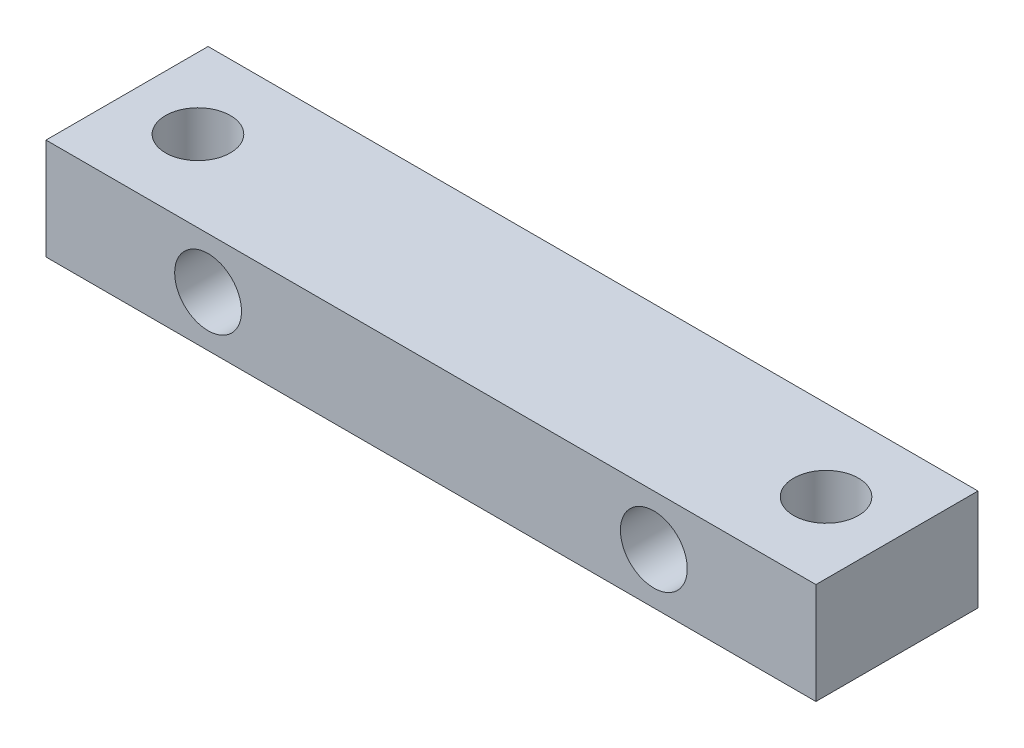
ISO-10303-21;
HEADER;
FILE_DESCRIPTION(('STEP AP214'),'2;1');
FILE_NAME('part.step','',(''),(''),'','','');
FILE_SCHEMA(('AUTOMOTIVE_DESIGN { 1 0 10303 214 1 1 1 1 }'));
ENDSEC;
DATA;
#1=APPLICATION_CONTEXT('core data for automotive mechanical design processes');
#2=APPLICATION_PROTOCOL_DEFINITION('international standard','automotive_design',2000,#1);
#3=PRODUCT_CONTEXT('',#1,'mechanical');
#4=PRODUCT('Part','Part','',(#3));
#5=PRODUCT_RELATED_PRODUCT_CATEGORY('part','',(#4));
#6=PRODUCT_DEFINITION_FORMATION('','',#4);
#7=PRODUCT_DEFINITION_CONTEXT('part definition',#1,'design');
#8=PRODUCT_DEFINITION('design','',#6,#7);
#9=PRODUCT_DEFINITION_SHAPE('','',#8);
#10=(LENGTH_UNIT() NAMED_UNIT(*) SI_UNIT(.MILLI.,.METRE.));
#11=(NAMED_UNIT(*) PLANE_ANGLE_UNIT() SI_UNIT($,.RADIAN.));
#12=(NAMED_UNIT(*) SI_UNIT($,.STERADIAN.) SOLID_ANGLE_UNIT());
#13=UNCERTAINTY_MEASURE_WITH_UNIT(LENGTH_MEASURE(1.E-05),#10,'distance_accuracy_value','');
#14=(GEOMETRIC_REPRESENTATION_CONTEXT(3) GLOBAL_UNCERTAINTY_ASSIGNED_CONTEXT((#13)) GLOBAL_UNIT_ASSIGNED_CONTEXT((#10,
#11,#12)) REPRESENTATION_CONTEXT('',''));
#15=CARTESIAN_POINT('',(0.,0.,0.));
#16=DIRECTION('',(0.,0.,1.));
#17=DIRECTION('',(1.,0.,0.));
#18=AXIS2_PLACEMENT_3D('',#15,#16,#17);
#19=CARTESIAN_POINT('',(0.,0.,8.));
#20=DIRECTION('',(1.,0.,0.));
#21=DIRECTION('',(0.,0.,-1.));
#22=AXIS2_PLACEMENT_3D('',#19,#20,#21);
#23=PLANE('',#22);
#24=DIRECTION('',(0.,-1.,0.));
#25=VECTOR('',#24,1.);
#26=CARTESIAN_POINT('',(0.,0.,0.));
#27=LINE('',#26,#25);
#28=CARTESIAN_POINT('',(0.,5.,0.));
#29=VERTEX_POINT('',#28);
#30=CARTESIAN_POINT('',(0.,0.,0.));
#31=VERTEX_POINT('',#30);
#32=EDGE_CURVE('E100',#29,#31,#27,.T.);
#33=ORIENTED_EDGE('',*,*,#32,.T.);
#34=DIRECTION('',(0.,0.,-1.));
#35=VECTOR('',#34,1.);
#36=CARTESIAN_POINT('',(0.,0.,8.));
#37=LINE('',#36,#35);
#38=CARTESIAN_POINT('',(0.,0.,8.));
#39=VERTEX_POINT('',#38);
#40=EDGE_CURVE('E11',#39,#31,#37,.T.);
#41=ORIENTED_EDGE('',*,*,#40,.F.);
#42=DIRECTION('',(0.,-1.,0.));
#43=VECTOR('',#42,1.);
#44=CARTESIAN_POINT('',(0.,0.,8.));
#45=LINE('',#44,#43);
#46=CARTESIAN_POINT('',(0.,5.,8.));
#47=VERTEX_POINT('',#46);
#48=EDGE_CURVE('E88',#47,#39,#45,.T.);
#49=ORIENTED_EDGE('',*,*,#48,.F.);
#50=DIRECTION('',(0.,0.,-1.));
#51=VECTOR('',#50,1.);
#52=CARTESIAN_POINT('',(0.,5.,8.));
#53=LINE('',#52,#51);
#54=EDGE_CURVE('E96',#47,#29,#53,.T.);
#55=ORIENTED_EDGE('',*,*,#54,.T.);
#56=EDGE_LOOP('',(#33,#41,#49,#55));
#57=FACE_BOUND('',#56,.T.);
#58=ADVANCED_FACE('F37',(#57),#23,.F.);
#59=CARTESIAN_POINT('',(0.,0.,8.));
#60=DIRECTION('',(0.,1.,0.));
#61=DIRECTION('',(0.,0.,1.));
#62=AXIS2_PLACEMENT_3D('',#59,#60,#61);
#63=PLANE('',#62);
#64=CARTESIAN_POINT('',(3.5,0.,4.));
#65=DIRECTION('',(0.,1.,0.));
#66=DIRECTION('',(0.,0.,1.));
#67=AXIS2_PLACEMENT_3D('',#64,#65,#66);
#68=CIRCLE('',#67,1.59999999999999);
#69=CARTESIAN_POINT('',(3.5,0.,5.59999999999999));
#70=VERTEX_POINT('',#69);
#71=EDGE_CURVE('E119',#70,#70,#68,.T.);
#72=ORIENTED_EDGE('',*,*,#71,.T.);
#73=EDGE_LOOP('',(#72));
#74=FACE_BOUND('',#73,.T.);
#75=CARTESIAN_POINT('',(34.5,0.,4.));
#76=DIRECTION('',(0.,1.,0.));
#77=DIRECTION('',(0.,0.,1.));
#78=AXIS2_PLACEMENT_3D('',#75,#76,#77);
#79=CIRCLE('',#78,1.59999999999999);
#80=CARTESIAN_POINT('',(34.5,0.,5.59999999999999));
#81=VERTEX_POINT('',#80);
#82=EDGE_CURVE('E103',#81,#81,#79,.T.);
#83=ORIENTED_EDGE('',*,*,#82,.T.);
#84=EDGE_LOOP('',(#83));
#85=FACE_BOUND('',#84,.T.);
#86=DIRECTION('',(1.,0.,0.));
#87=VECTOR('',#86,1.);
#88=CARTESIAN_POINT('',(0.,0.,0.));
#89=LINE('',#88,#87);
#90=CARTESIAN_POINT('',(38.,0.,0.));
#91=VERTEX_POINT('',#90);
#92=EDGE_CURVE('E92',#31,#91,#89,.T.);
#93=ORIENTED_EDGE('',*,*,#92,.T.);
#94=DIRECTION('',(0.,0.,-1.));
#95=VECTOR('',#94,1.);
#96=CARTESIAN_POINT('',(38.,0.,8.));
#97=LINE('',#96,#95);
#98=CARTESIAN_POINT('',(38.,0.,8.));
#99=VERTEX_POINT('',#98);
#100=EDGE_CURVE('E45',#99,#91,#97,.T.);
#101=ORIENTED_EDGE('',*,*,#100,.F.);
#102=DIRECTION('',(1.,0.,0.));
#103=VECTOR('',#102,1.);
#104=CARTESIAN_POINT('',(0.,0.,8.));
#105=LINE('',#104,#103);
#106=EDGE_CURVE('E83',#39,#99,#105,.T.);
#107=ORIENTED_EDGE('',*,*,#106,.F.);
#108=ORIENTED_EDGE('',*,*,#40,.T.);
#109=EDGE_LOOP('',(#93,#101,#107,#108));
#110=FACE_BOUND('',#109,.T.);
#111=ADVANCED_FACE('F91',(#74,#85,#110),#63,.F.);
#112=CARTESIAN_POINT('',(38.,0.,8.));
#113=DIRECTION('',(-1.,0.,0.));
#114=DIRECTION('',(0.,0.,1.));
#115=AXIS2_PLACEMENT_3D('',#112,#113,#114);
#116=PLANE('',#115);
#117=DIRECTION('',(0.,1.,0.));
#118=VECTOR('',#117,1.);
#119=CARTESIAN_POINT('',(38.,0.,0.));
#120=LINE('',#119,#118);
#121=CARTESIAN_POINT('',(38.,5.,0.));
#122=VERTEX_POINT('',#121);
#123=EDGE_CURVE('E70',#91,#122,#120,.T.);
#124=ORIENTED_EDGE('',*,*,#123,.T.);
#125=DIRECTION('',(0.,0.,-1.));
#126=VECTOR('',#125,1.);
#127=CARTESIAN_POINT('',(38.,5.,8.));
#128=LINE('',#127,#126);
#129=CARTESIAN_POINT('',(38.,5.,8.));
#130=VERTEX_POINT('',#129);
#131=EDGE_CURVE('E93',#130,#122,#128,.T.);
#132=ORIENTED_EDGE('',*,*,#131,.F.);
#133=DIRECTION('',(0.,1.,0.));
#134=VECTOR('',#133,1.);
#135=CARTESIAN_POINT('',(38.,0.,8.));
#136=LINE('',#135,#134);
#137=EDGE_CURVE('E86',#99,#130,#136,.T.);
#138=ORIENTED_EDGE('',*,*,#137,.F.);
#139=ORIENTED_EDGE('',*,*,#100,.T.);
#140=EDGE_LOOP('',(#124,#132,#138,#139));
#141=FACE_BOUND('',#140,.T.);
#142=ADVANCED_FACE('F94',(#141),#116,.F.);
#143=CARTESIAN_POINT('',(0.,5.,8.));
#144=DIRECTION('',(0.,-1.,0.));
#145=DIRECTION('',(0.,0.,-1.));
#146=AXIS2_PLACEMENT_3D('',#143,#144,#145);
#147=PLANE('',#146);
#148=CARTESIAN_POINT('',(3.5,5.,4.));
#149=DIRECTION('',(0.,1.,0.));
#150=DIRECTION('',(0.,0.,1.));
#151=AXIS2_PLACEMENT_3D('',#148,#149,#150);
#152=CIRCLE('',#151,1.59999999999999);
#153=CARTESIAN_POINT('',(3.5,5.,5.59999999999999));
#154=VERTEX_POINT('',#153);
#155=EDGE_CURVE('E122',#154,#154,#152,.T.);
#156=ORIENTED_EDGE('',*,*,#155,.F.);
#157=EDGE_LOOP('',(#156));
#158=FACE_BOUND('',#157,.T.);
#159=CARTESIAN_POINT('',(34.5,5.,4.));
#160=DIRECTION('',(0.,1.,0.));
#161=DIRECTION('',(0.,0.,1.));
#162=AXIS2_PLACEMENT_3D('',#159,#160,#161);
#163=CIRCLE('',#162,1.59999999999999);
#164=CARTESIAN_POINT('',(34.5,5.,5.59999999999999));
#165=VERTEX_POINT('',#164);
#166=EDGE_CURVE('E116',#165,#165,#163,.T.);
#167=ORIENTED_EDGE('',*,*,#166,.F.);
#168=EDGE_LOOP('',(#167));
#169=FACE_BOUND('',#168,.T.);
#170=DIRECTION('',(-1.,0.,0.));
#171=VECTOR('',#170,1.);
#172=CARTESIAN_POINT('',(0.,5.,0.));
#173=LINE('',#172,#171);
#174=EDGE_CURVE('E76',#122,#29,#173,.T.);
#175=ORIENTED_EDGE('',*,*,#174,.T.);
#176=ORIENTED_EDGE('',*,*,#54,.F.);
#177=DIRECTION('',(-1.,0.,0.));
#178=VECTOR('',#177,1.);
#179=CARTESIAN_POINT('',(0.,5.,8.));
#180=LINE('',#179,#178);
#181=EDGE_CURVE('E53',#130,#47,#180,.T.);
#182=ORIENTED_EDGE('',*,*,#181,.F.);
#183=ORIENTED_EDGE('',*,*,#131,.T.);
#184=EDGE_LOOP('',(#175,#176,#182,#183));
#185=FACE_BOUND('',#184,.T.);
#186=ADVANCED_FACE('F108',(#158,#169,#185),#147,.F.);
#187=CARTESIAN_POINT('',(0.,0.,8.));
#188=DIRECTION('',(0.,0.,-1.));
#189=DIRECTION('',(-1.,0.,0.));
#190=AXIS2_PLACEMENT_3D('',#187,#188,#189);
#191=PLANE('',#190);
#192=CARTESIAN_POINT('',(8.,2.5,8.));
#193=DIRECTION('',(0.,0.,-1.));
#194=DIRECTION('',(-1.,0.,0.));
#195=AXIS2_PLACEMENT_3D('',#192,#193,#194);
#196=CIRCLE('',#195,1.64999999999999);
#197=CARTESIAN_POINT('',(6.35,2.5,8.));
#198=VERTEX_POINT('',#197);
#199=EDGE_CURVE('E131',#198,#198,#196,.T.);
#200=ORIENTED_EDGE('',*,*,#199,.T.);
#201=EDGE_LOOP('',(#200));
#202=FACE_BOUND('',#201,.T.);
#203=CARTESIAN_POINT('',(30.,2.5,8.));
#204=DIRECTION('',(0.,0.,-1.));
#205=DIRECTION('',(-1.,0.,0.));
#206=AXIS2_PLACEMENT_3D('',#203,#204,#205);
#207=CIRCLE('',#206,1.64999999999999);
#208=CARTESIAN_POINT('',(28.35,2.5,8.));
#209=VERTEX_POINT('',#208);
#210=EDGE_CURVE('E125',#209,#209,#207,.T.);
#211=ORIENTED_EDGE('',*,*,#210,.T.);
#212=EDGE_LOOP('',(#211));
#213=FACE_BOUND('',#212,.T.);
#214=ORIENTED_EDGE('',*,*,#48,.T.);
#215=ORIENTED_EDGE('',*,*,#106,.T.);
#216=ORIENTED_EDGE('',*,*,#137,.T.);
#217=ORIENTED_EDGE('',*,*,#181,.T.);
#218=EDGE_LOOP('',(#214,#215,#216,#217));
#219=FACE_BOUND('',#218,.T.);
#220=ADVANCED_FACE('F84',(#202,#213,#219),#191,.F.);
#221=CARTESIAN_POINT('',(0.,0.,0.));
#222=DIRECTION('',(0.,0.,-1.));
#223=DIRECTION('',(-1.,0.,0.));
#224=AXIS2_PLACEMENT_3D('',#221,#222,#223);
#225=PLANE('',#224);
#226=CARTESIAN_POINT('',(8.,2.5,0.));
#227=DIRECTION('',(0.,0.,-1.));
#228=DIRECTION('',(-1.,0.,0.));
#229=AXIS2_PLACEMENT_3D('',#226,#227,#228);
#230=CIRCLE('',#229,1.64999999999999);
#231=CARTESIAN_POINT('',(6.35000000000001,2.5,0.));
#232=VERTEX_POINT('',#231);
#233=EDGE_CURVE('E134',#232,#232,#230,.T.);
#234=ORIENTED_EDGE('',*,*,#233,.F.);
#235=EDGE_LOOP('',(#234));
#236=FACE_BOUND('',#235,.T.);
#237=CARTESIAN_POINT('',(30.,2.5,0.));
#238=DIRECTION('',(0.,0.,-1.));
#239=DIRECTION('',(-1.,0.,0.));
#240=AXIS2_PLACEMENT_3D('',#237,#238,#239);
#241=CIRCLE('',#240,1.64999999999999);
#242=CARTESIAN_POINT('',(28.35,2.5,0.));
#243=VERTEX_POINT('',#242);
#244=EDGE_CURVE('E128',#243,#243,#241,.T.);
#245=ORIENTED_EDGE('',*,*,#244,.F.);
#246=EDGE_LOOP('',(#245));
#247=FACE_BOUND('',#246,.T.);
#248=ORIENTED_EDGE('',*,*,#32,.F.);
#249=ORIENTED_EDGE('',*,*,#174,.F.);
#250=ORIENTED_EDGE('',*,*,#123,.F.);
#251=ORIENTED_EDGE('',*,*,#92,.F.);
#252=EDGE_LOOP('',(#248,#249,#250,#251));
#253=FACE_BOUND('',#252,.T.);
#254=ADVANCED_FACE('F111',(#236,#247,#253),#225,.T.);
#255=CARTESIAN_POINT('',(34.5,5.,4.));
#256=DIRECTION('',(0.,1.,0.));
#257=DIRECTION('',(0.,0.,1.));
#258=AXIS2_PLACEMENT_3D('',#255,#256,#257);
#259=CYLINDRICAL_SURFACE('',#258,1.59999999999999);
#260=ORIENTED_EDGE('',*,*,#166,.T.);
#261=EDGE_LOOP('',(#260));
#262=FACE_BOUND('',#261,.T.);
#263=ORIENTED_EDGE('',*,*,#82,.F.);
#264=EDGE_LOOP('',(#263));
#265=FACE_BOUND('',#264,.T.);
#266=ADVANCED_FACE('F142',(#262,#265),#259,.F.);
#267=CARTESIAN_POINT('',(3.5,5.,4.));
#268=DIRECTION('',(0.,1.,0.));
#269=DIRECTION('',(0.,0.,1.));
#270=AXIS2_PLACEMENT_3D('',#267,#268,#269);
#271=CYLINDRICAL_SURFACE('',#270,1.59999999999999);
#272=ORIENTED_EDGE('',*,*,#155,.T.);
#273=EDGE_LOOP('',(#272));
#274=FACE_BOUND('',#273,.T.);
#275=ORIENTED_EDGE('',*,*,#71,.F.);
#276=EDGE_LOOP('',(#275));
#277=FACE_BOUND('',#276,.T.);
#278=ADVANCED_FACE('F148',(#274,#277),#271,.F.);
#279=CARTESIAN_POINT('',(30.,2.5,0.));
#280=DIRECTION('',(0.,0.,-1.));
#281=DIRECTION('',(-1.,0.,0.));
#282=AXIS2_PLACEMENT_3D('',#279,#280,#281);
#283=CYLINDRICAL_SURFACE('',#282,1.64999999999999);
#284=ORIENTED_EDGE('',*,*,#210,.F.);
#285=EDGE_LOOP('',(#284));
#286=FACE_BOUND('',#285,.T.);
#287=ORIENTED_EDGE('',*,*,#244,.T.);
#288=EDGE_LOOP('',(#287));
#289=FACE_BOUND('',#288,.T.);
#290=ADVANCED_FACE('F146',(#286,#289),#283,.F.);
#291=CARTESIAN_POINT('',(8.,2.5,0.));
#292=DIRECTION('',(0.,0.,-1.));
#293=DIRECTION('',(-1.,0.,0.));
#294=AXIS2_PLACEMENT_3D('',#291,#292,#293);
#295=CYLINDRICAL_SURFACE('',#294,1.64999999999999);
#296=ORIENTED_EDGE('',*,*,#199,.F.);
#297=EDGE_LOOP('',(#296));
#298=FACE_BOUND('',#297,.T.);
#299=ORIENTED_EDGE('',*,*,#233,.T.);
#300=EDGE_LOOP('',(#299));
#301=FACE_BOUND('',#300,.T.);
#302=ADVANCED_FACE('F138',(#298,#301),#295,.F.);
#303=CLOSED_SHELL('',(#58,#111,#142,#186,#220,#254,#266,#278,#290,#302));
#304=MANIFOLD_SOLID_BREP('B2',#303);
#305=ADVANCED_BREP_SHAPE_REPRESENTATION('',(#18,#304),#14);
#306=SHAPE_DEFINITION_REPRESENTATION(#9,#305);
ENDSEC;
END-ISO-10303-21;
